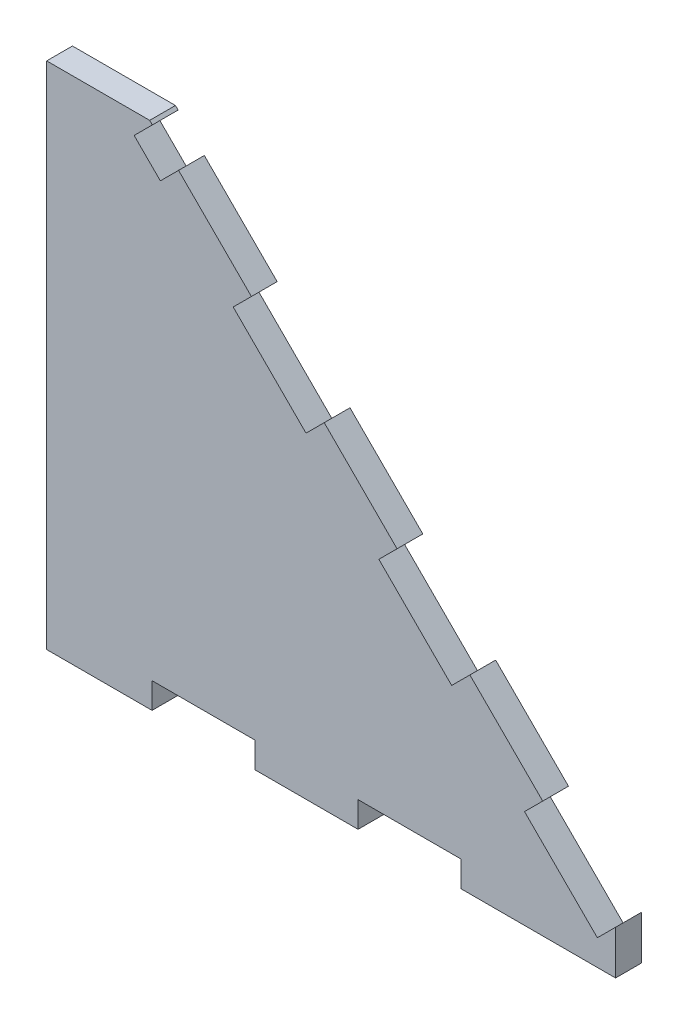
ISO-10303-21;
HEADER;
FILE_DESCRIPTION(('STEP AP214'),'2;1');
FILE_NAME('part.step','',(''),(''),'','','');
FILE_SCHEMA(('AUTOMOTIVE_DESIGN { 1 0 10303 214 1 1 1 1 }'));
ENDSEC;
DATA;
#1=APPLICATION_CONTEXT('core data for automotive mechanical design processes');
#2=APPLICATION_PROTOCOL_DEFINITION('international standard','automotive_design',2000,#1);
#3=PRODUCT_CONTEXT('',#1,'mechanical');
#4=PRODUCT('Part','Part','',(#3));
#5=PRODUCT_RELATED_PRODUCT_CATEGORY('part','',(#4));
#6=PRODUCT_DEFINITION_FORMATION('','',#4);
#7=PRODUCT_DEFINITION_CONTEXT('part definition',#1,'design');
#8=PRODUCT_DEFINITION('design','',#6,#7);
#9=PRODUCT_DEFINITION_SHAPE('','',#8);
#10=(LENGTH_UNIT() NAMED_UNIT(*) SI_UNIT(.MILLI.,.METRE.));
#11=(NAMED_UNIT(*) PLANE_ANGLE_UNIT() SI_UNIT($,.RADIAN.));
#12=(NAMED_UNIT(*) SI_UNIT($,.STERADIAN.) SOLID_ANGLE_UNIT());
#13=UNCERTAINTY_MEASURE_WITH_UNIT(LENGTH_MEASURE(1.E-05),#10,'distance_accuracy_value','');
#14=(GEOMETRIC_REPRESENTATION_CONTEXT(3) GLOBAL_UNCERTAINTY_ASSIGNED_CONTEXT((#13)) GLOBAL_UNIT_ASSIGNED_CONTEXT((#10,
#11,#12)) REPRESENTATION_CONTEXT('',''));
#15=CARTESIAN_POINT('',(0.,0.,0.));
#16=DIRECTION('',(0.,0.,1.));
#17=DIRECTION('',(1.,0.,0.));
#18=AXIS2_PLACEMENT_3D('',#15,#16,#17);
#19=CARTESIAN_POINT('',(0.,0.,3.175));
#20=DIRECTION('',(0.,1.,0.));
#21=DIRECTION('',(0.,0.,1.));
#22=AXIS2_PLACEMENT_3D('',#19,#20,#21);
#23=PLANE('',#22);
#24=DIRECTION('',(1.,0.,0.));
#25=VECTOR('',#24,1.);
#26=CARTESIAN_POINT('',(0.,0.,0.));
#27=LINE('',#26,#25);
#28=CARTESIAN_POINT('',(25.6917288172166,0.,0.));
#29=VERTEX_POINT('',#28);
#30=CARTESIAN_POINT('',(38.3917288172166,0.,0.));
#31=VERTEX_POINT('',#30);
#32=EDGE_CURVE('E237',#29,#31,#27,.T.);
#33=ORIENTED_EDGE('',*,*,#32,.T.);
#34=DIRECTION('',(0.,0.,1.));
#35=VECTOR('',#34,1.);
#36=CARTESIAN_POINT('',(38.3917288172166,0.,0.));
#37=LINE('',#36,#35);
#38=CARTESIAN_POINT('',(38.3917288172166,0.,3.175));
#39=VERTEX_POINT('',#38);
#40=EDGE_CURVE('E220',#31,#39,#37,.T.);
#41=ORIENTED_EDGE('',*,*,#40,.T.);
#42=DIRECTION('',(1.,0.,0.));
#43=VECTOR('',#42,1.);
#44=CARTESIAN_POINT('',(0.,0.,3.175));
#45=LINE('',#44,#43);
#46=CARTESIAN_POINT('',(25.6917288172166,0.,3.175));
#47=VERTEX_POINT('',#46);
#48=EDGE_CURVE('E460',#47,#39,#45,.T.);
#49=ORIENTED_EDGE('',*,*,#48,.F.);
#50=DIRECTION('',(0.,0.,1.));
#51=VECTOR('',#50,1.);
#52=CARTESIAN_POINT('',(25.6917288172166,0.,0.));
#53=LINE('',#52,#51);
#54=EDGE_CURVE('E243',#29,#47,#53,.T.);
#55=ORIENTED_EDGE('',*,*,#54,.F.);
#56=EDGE_LOOP('',(#33,#41,#49,#55));
#57=FACE_BOUND('',#56,.T.);
#58=ADVANCED_FACE('F34',(#57),#23,.F.);
#59=CARTESIAN_POINT('',(0.,0.,0.));
#60=VERTEX_POINT('',#59);
#61=CARTESIAN_POINT('',(12.9917288172166,0.,0.));
#62=VERTEX_POINT('',#61);
#63=EDGE_CURVE('E244',#60,#62,#27,.T.);
#64=ORIENTED_EDGE('',*,*,#63,.T.);
#65=DIRECTION('',(0.,0.,1.));
#66=VECTOR('',#65,1.);
#67=CARTESIAN_POINT('',(12.9917288172166,0.,0.));
#68=LINE('',#67,#66);
#69=CARTESIAN_POINT('',(12.9917288172166,0.,3.175));
#70=VERTEX_POINT('',#69);
#71=EDGE_CURVE('E426',#62,#70,#68,.T.);
#72=ORIENTED_EDGE('',*,*,#71,.T.);
#73=CARTESIAN_POINT('',(0.,0.,3.175));
#74=VERTEX_POINT('',#73);
#75=EDGE_CURVE('E457',#74,#70,#45,.T.);
#76=ORIENTED_EDGE('',*,*,#75,.F.);
#77=DIRECTION('',(0.,0.,-1.));
#78=VECTOR('',#77,1.);
#79=CARTESIAN_POINT('',(0.,0.,3.175));
#80=LINE('',#79,#78);
#81=EDGE_CURVE('E321',#74,#60,#80,.T.);
#82=ORIENTED_EDGE('',*,*,#81,.T.);
#83=EDGE_LOOP('',(#64,#72,#76,#82));
#84=FACE_BOUND('',#83,.T.);
#85=ADVANCED_FACE('F516',(#84),#23,.F.);
#86=CARTESIAN_POINT('',(35.5358323934748,35.5358323934746,3.175));
#87=DIRECTION('',(0.707106781186549,0.707106781186546,0.));
#88=DIRECTION('',(-0.707106781186546,0.707106781186549,0.));
#89=AXIS2_PLACEMENT_3D('',#86,#87,#88);
#90=PLANE('',#89);
#91=DIRECTION('',(0.707106781186546,-0.707106781186549,0.));
#92=VECTOR('',#91,1.);
#93=CARTESIAN_POINT('',(35.5358323934748,35.5358323934746,0.));
#94=LINE('',#93,#92);
#95=CARTESIAN_POINT('',(10.7822358569496,60.2894289299999,0.));
#96=VERTEX_POINT('',#95);
#97=CARTESIAN_POINT('',(14.0151280605345,57.056536726415,0.));
#98=VERTEX_POINT('',#97);
#99=EDGE_CURVE('E344',#96,#98,#94,.T.);
#100=ORIENTED_EDGE('',*,*,#99,.F.);
#101=DIRECTION('',(0.,0.,-1.));
#102=VECTOR('',#101,1.);
#103=CARTESIAN_POINT('',(10.7822358569496,60.2894289299999,3.175));
#104=LINE('',#103,#102);
#105=CARTESIAN_POINT('',(10.7822358569496,60.2894289299999,3.175));
#106=VERTEX_POINT('',#105);
#107=EDGE_CURVE('E11',#106,#96,#104,.T.);
#108=ORIENTED_EDGE('',*,*,#107,.F.);
#109=DIRECTION('',(0.707106781186546,-0.707106781186549,0.));
#110=VECTOR('',#109,1.);
#111=CARTESIAN_POINT('',(35.5358323934748,35.5358323934746,3.175));
#112=LINE('',#111,#110);
#113=CARTESIAN_POINT('',(14.0151280605345,57.056536726415,3.175));
#114=VERTEX_POINT('',#113);
#115=EDGE_CURVE('E288',#106,#114,#112,.T.);
#116=ORIENTED_EDGE('',*,*,#115,.T.);
#117=DIRECTION('',(0.,0.,-1.));
#118=VECTOR('',#117,1.);
#119=CARTESIAN_POINT('',(14.0151280605345,57.056536726415,3.175));
#120=LINE('',#119,#118);
#121=EDGE_CURVE('E289',#114,#98,#120,.T.);
#122=ORIENTED_EDGE('',*,*,#121,.T.);
#123=EDGE_LOOP('',(#100,#108,#116,#122));
#124=FACE_BOUND('',#123,.T.);
#125=ADVANCED_FACE('F36',(#124),#90,.T.);
#126=CARTESIAN_POINT('',(-24.7535965365252,24.7535965365252,3.175));
#127=DIRECTION('',(0.707106781186546,-0.707106781186548,0.));
#128=DIRECTION('',(0.707106781186549,0.707106781186547,0.));
#129=AXIS2_PLACEMENT_3D('',#126,#127,#128);
#130=PLANE('',#129);
#131=DIRECTION('',(-0.707106781186549,-0.707106781186546,0.));
#132=VECTOR('',#131,1.);
#133=CARTESIAN_POINT('',(-24.7535965365252,24.7535965365252,0.));
#134=LINE('',#133,#132);
#135=CARTESIAN_POINT('',(13.0272998872169,62.5344929602672,0.));
#136=VERTEX_POINT('',#135);
#137=EDGE_CURVE('E340',#136,#96,#134,.T.);
#138=ORIENTED_EDGE('',*,*,#137,.F.);
#139=DIRECTION('',(0.,0.,-1.));
#140=VECTOR('',#139,1.);
#141=CARTESIAN_POINT('',(13.0272998872169,62.5344929602672,3.175));
#142=LINE('',#141,#140);
#143=CARTESIAN_POINT('',(13.0272998872169,62.5344929602672,3.175));
#144=VERTEX_POINT('',#143);
#145=EDGE_CURVE('E42',#144,#136,#142,.T.);
#146=ORIENTED_EDGE('',*,*,#145,.F.);
#147=DIRECTION('',(-0.707106781186549,-0.707106781186546,0.));
#148=VECTOR('',#147,1.);
#149=CARTESIAN_POINT('',(-24.7535965365252,24.7535965365252,3.175));
#150=LINE('',#149,#148);
#151=EDGE_CURVE('E447',#144,#106,#150,.T.);
#152=ORIENTED_EDGE('',*,*,#151,.T.);
#153=ORIENTED_EDGE('',*,*,#107,.T.);
#154=EDGE_LOOP('',(#138,#146,#152,#153));
#155=FACE_BOUND('',#154,.T.);
#156=ADVANCED_FACE('F341',(#155),#130,.T.);
#157=CARTESIAN_POINT('',(37.7808964237421,37.7808964237419,3.175));
#158=DIRECTION('',(0.707106781186549,0.707106781186546,0.));
#159=DIRECTION('',(-0.707106781186546,0.707106781186549,0.));
#160=AXIS2_PLACEMENT_3D('',#157,#158,#159);
#161=PLANE('',#160);
#162=DIRECTION('',(0.707106781186546,-0.707106781186549,0.));
#163=VECTOR('',#162,1.);
#164=CARTESIAN_POINT('',(37.7808964237421,37.7808964237419,0.));
#165=LINE('',#164,#163);
#166=CARTESIAN_POINT('',(12.7,62.8617928474841,0.));
#167=VERTEX_POINT('',#166);
#168=EDGE_CURVE('E332',#167,#136,#165,.T.);
#169=ORIENTED_EDGE('',*,*,#168,.F.);
#170=DIRECTION('',(0.,0.,-1.));
#171=VECTOR('',#170,1.);
#172=CARTESIAN_POINT('',(12.7,62.8617928474841,3.175));
#173=LINE('',#172,#171);
#174=CARTESIAN_POINT('',(12.7,62.8617928474841,3.175));
#175=VERTEX_POINT('',#174);
#176=EDGE_CURVE('E325',#175,#167,#173,.T.);
#177=ORIENTED_EDGE('',*,*,#176,.F.);
#178=DIRECTION('',(0.707106781186546,-0.707106781186549,0.));
#179=VECTOR('',#178,1.);
#180=CARTESIAN_POINT('',(37.7808964237421,37.7808964237419,3.175));
#181=LINE('',#180,#179);
#182=EDGE_CURVE('E335',#175,#144,#181,.T.);
#183=ORIENTED_EDGE('',*,*,#182,.T.);
#184=ORIENTED_EDGE('',*,*,#145,.T.);
#185=EDGE_LOOP('',(#169,#177,#183,#184));
#186=FACE_BOUND('',#185,.T.);
#187=ADVANCED_FACE('F330',(#186),#161,.T.);
#188=CARTESIAN_POINT('',(0.,62.8617928474841,3.175));
#189=DIRECTION('',(0.,1.,0.));
#190=DIRECTION('',(0.,0.,1.));
#191=AXIS2_PLACEMENT_3D('',#188,#189,#190);
#192=PLANE('',#191);
#193=DIRECTION('',(1.,0.,0.));
#194=VECTOR('',#193,1.);
#195=CARTESIAN_POINT('',(0.,62.8617928474841,0.));
#196=LINE('',#195,#194);
#197=CARTESIAN_POINT('',(0.,62.8617928474841,0.));
#198=VERTEX_POINT('',#197);
#199=EDGE_CURVE('E348',#198,#167,#196,.T.);
#200=ORIENTED_EDGE('',*,*,#199,.F.);
#201=DIRECTION('',(0.,0.,-1.));
#202=VECTOR('',#201,1.);
#203=CARTESIAN_POINT('',(0.,62.8617928474841,3.175));
#204=LINE('',#203,#202);
#205=CARTESIAN_POINT('',(0.,62.8617928474841,3.175));
#206=VERTEX_POINT('',#205);
#207=EDGE_CURVE('E323',#206,#198,#204,.T.);
#208=ORIENTED_EDGE('',*,*,#207,.F.);
#209=DIRECTION('',(1.,0.,0.));
#210=VECTOR('',#209,1.);
#211=CARTESIAN_POINT('',(0.,62.8617928474841,3.175));
#212=LINE('',#211,#210);
#213=EDGE_CURVE('E450',#206,#175,#212,.T.);
#214=ORIENTED_EDGE('',*,*,#213,.T.);
#215=ORIENTED_EDGE('',*,*,#176,.T.);
#216=EDGE_LOOP('',(#200,#208,#214,#215));
#217=FACE_BOUND('',#216,.T.);
#218=ADVANCED_FACE('F530',(#217),#192,.T.);
#219=CARTESIAN_POINT('',(0.,0.,3.175));
#220=DIRECTION('',(-1.,0.,0.));
#221=DIRECTION('',(0.,0.,1.));
#222=AXIS2_PLACEMENT_3D('',#219,#220,#221);
#223=PLANE('',#222);
#224=DIRECTION('',(0.,1.,0.));
#225=VECTOR('',#224,1.);
#226=CARTESIAN_POINT('',(0.,0.,0.));
#227=LINE('',#226,#225);
#228=EDGE_CURVE('E249',#60,#198,#227,.T.);
#229=ORIENTED_EDGE('',*,*,#228,.F.);
#230=ORIENTED_EDGE('',*,*,#81,.F.);
#231=DIRECTION('',(0.,1.,0.));
#232=VECTOR('',#231,1.);
#233=CARTESIAN_POINT('',(0.,0.,3.175));
#234=LINE('',#233,#232);
#235=EDGE_CURVE('E454',#74,#206,#234,.T.);
#236=ORIENTED_EDGE('',*,*,#235,.T.);
#237=ORIENTED_EDGE('',*,*,#207,.T.);
#238=EDGE_LOOP('',(#229,#230,#236,#237));
#239=FACE_BOUND('',#238,.T.);
#240=ADVANCED_FACE('F525',(#239),#223,.T.);
#241=CARTESIAN_POINT('',(51.0917288172166,0.,3.175));
#242=VERTEX_POINT('',#241);
#243=CARTESIAN_POINT('',(70.1417288172166,0.,3.175));
#244=VERTEX_POINT('',#243);
#245=EDGE_CURVE('E411',#242,#244,#45,.T.);
#246=ORIENTED_EDGE('',*,*,#245,.F.);
#247=DIRECTION('',(0.,0.,1.));
#248=VECTOR('',#247,1.);
#249=CARTESIAN_POINT('',(51.0917288172166,0.,0.));
#250=LINE('',#249,#248);
#251=CARTESIAN_POINT('',(51.0917288172166,0.,0.));
#252=VERTEX_POINT('',#251);
#253=EDGE_CURVE('E231',#252,#242,#250,.T.);
#254=ORIENTED_EDGE('',*,*,#253,.F.);
#255=CARTESIAN_POINT('',(70.1417288172166,0.,0.));
#256=VERTEX_POINT('',#255);
#257=EDGE_CURVE('E245',#252,#256,#27,.T.);
#258=ORIENTED_EDGE('',*,*,#257,.T.);
#259=DIRECTION('',(0.,0.,-1.));
#260=VECTOR('',#259,1.);
#261=CARTESIAN_POINT('',(70.1417288172166,0.,3.175));
#262=LINE('',#261,#260);
#263=EDGE_CURVE('E318',#244,#256,#262,.T.);
#264=ORIENTED_EDGE('',*,*,#263,.F.);
#265=EDGE_LOOP('',(#246,#254,#258,#264));
#266=FACE_BOUND('',#265,.T.);
#267=ADVANCED_FACE('F410',(#266),#23,.F.);
#268=CARTESIAN_POINT('',(70.1417288172166,0.,3.175));
#269=DIRECTION('',(1.,0.,0.));
#270=DIRECTION('',(0.,0.,-1.));
#271=AXIS2_PLACEMENT_3D('',#268,#269,#270);
#272=PLANE('',#271);
#273=DIRECTION('',(0.,-1.,0.));
#274=VECTOR('',#273,1.);
#275=CARTESIAN_POINT('',(70.1417288172166,0.,0.));
#276=LINE('',#275,#274);
#277=CARTESIAN_POINT('',(70.1417288172166,5.42006403026728,0.));
#278=VERTEX_POINT('',#277);
#279=EDGE_CURVE('E248',#278,#256,#276,.T.);
#280=ORIENTED_EDGE('',*,*,#279,.F.);
#281=DIRECTION('',(0.,0.,-1.));
#282=VECTOR('',#281,1.);
#283=CARTESIAN_POINT('',(70.1417288172166,5.42006403026728,3.175));
#284=LINE('',#283,#282);
#285=CARTESIAN_POINT('',(70.1417288172166,5.42006403026728,3.175));
#286=VERTEX_POINT('',#285);
#287=EDGE_CURVE('E316',#286,#278,#284,.T.);
#288=ORIENTED_EDGE('',*,*,#287,.F.);
#289=DIRECTION('',(0.,-1.,0.));
#290=VECTOR('',#289,1.);
#291=CARTESIAN_POINT('',(70.1417288172166,0.,3.175));
#292=LINE('',#291,#290);
#293=EDGE_CURVE('E404',#286,#244,#292,.T.);
#294=ORIENTED_EDGE('',*,*,#293,.T.);
#295=ORIENTED_EDGE('',*,*,#263,.T.);
#296=EDGE_LOOP('',(#280,#288,#294,#295));
#297=FACE_BOUND('',#296,.T.);
#298=ADVANCED_FACE('F403',(#297),#272,.T.);
#299=CARTESIAN_POINT('',(32.3608323934744,-32.3608323934746,3.175));
#300=DIRECTION('',(0.707106781186545,-0.70710678118655,0.));
#301=DIRECTION('',(0.70710678118655,0.707106781186545,0.));
#302=AXIS2_PLACEMENT_3D('',#299,#300,#301);
#303=PLANE('',#302);
#304=DIRECTION('',(-0.70710678118655,-0.707106781186545,0.));
#305=VECTOR('',#304,1.);
#306=CARTESIAN_POINT('',(32.3608323934744,-32.3608323934746,0.));
#307=LINE('',#306,#305);
#308=CARTESIAN_POINT('',(67.8966647869493,3.175,0.));
#309=VERTEX_POINT('',#308);
#310=EDGE_CURVE('E255',#278,#309,#307,.T.);
#311=ORIENTED_EDGE('',*,*,#310,.T.);
#312=DIRECTION('',(0.,0.,-1.));
#313=VECTOR('',#312,1.);
#314=CARTESIAN_POINT('',(67.8966647869493,3.175,3.175));
#315=LINE('',#314,#313);
#316=CARTESIAN_POINT('',(67.8966647869493,3.175,3.175));
#317=VERTEX_POINT('',#316);
#318=EDGE_CURVE('E314',#317,#309,#315,.T.);
#319=ORIENTED_EDGE('',*,*,#318,.F.);
#320=DIRECTION('',(-0.70710678118655,-0.707106781186545,0.));
#321=VECTOR('',#320,1.);
#322=CARTESIAN_POINT('',(32.3608323934744,-32.3608323934746,3.175));
#323=LINE('',#322,#321);
#324=EDGE_CURVE('E399',#286,#317,#323,.T.);
#325=ORIENTED_EDGE('',*,*,#324,.F.);
#326=ORIENTED_EDGE('',*,*,#287,.T.);
#327=EDGE_LOOP('',(#311,#319,#325,#326));
#328=FACE_BOUND('',#327,.T.);
#329=ADVANCED_FACE('F398',(#328),#303,.F.);
#330=CARTESIAN_POINT('',(35.5358323934748,35.5358323934746,3.175));
#331=DIRECTION('',(0.707106781186549,0.707106781186546,0.));
#332=DIRECTION('',(-0.707106781186546,0.707106781186549,0.));
#333=AXIS2_PLACEMENT_3D('',#330,#331,#332);
#334=PLANE('',#333);
#335=DIRECTION('',(0.707106781186546,-0.707106781186549,0.));
#336=VECTOR('',#335,1.);
#337=CARTESIAN_POINT('',(35.5358323934748,35.5358323934746,0.));
#338=LINE('',#337,#336);
#339=CARTESIAN_POINT('',(58.9164086658802,12.1552561210692,0.));
#340=VERTEX_POINT('',#339);
#341=EDGE_CURVE('E258',#340,#309,#338,.T.);
#342=ORIENTED_EDGE('',*,*,#341,.F.);
#343=DIRECTION('',(0.,0.,-1.));
#344=VECTOR('',#343,1.);
#345=CARTESIAN_POINT('',(58.9164086658802,12.1552561210692,3.175));
#346=LINE('',#345,#344);
#347=CARTESIAN_POINT('',(58.9164086658802,12.1552561210692,3.175));
#348=VERTEX_POINT('',#347);
#349=EDGE_CURVE('E312',#348,#340,#346,.T.);
#350=ORIENTED_EDGE('',*,*,#349,.F.);
#351=DIRECTION('',(0.707106781186546,-0.707106781186549,0.));
#352=VECTOR('',#351,1.);
#353=CARTESIAN_POINT('',(35.5358323934748,35.5358323934746,3.175));
#354=LINE('',#353,#352);
#355=EDGE_CURVE('E395',#348,#317,#354,.T.);
#356=ORIENTED_EDGE('',*,*,#355,.T.);
#357=ORIENTED_EDGE('',*,*,#318,.T.);
#358=EDGE_LOOP('',(#342,#350,#356,#357));
#359=FACE_BOUND('',#358,.T.);
#360=ADVANCED_FACE('F391',(#359),#334,.T.);
#361=CARTESIAN_POINT('',(23.3805762724053,-23.3805762724055,3.175));
#362=DIRECTION('',(0.707106781186545,-0.70710678118655,0.));
#363=DIRECTION('',(0.70710678118655,0.707106781186545,0.));
#364=AXIS2_PLACEMENT_3D('',#361,#362,#363);
#365=PLANE('',#364);
#366=DIRECTION('',(-0.70710678118655,-0.707106781186545,0.));
#367=VECTOR('',#366,1.);
#368=CARTESIAN_POINT('',(23.3805762724053,-23.3805762724055,0.));
#369=LINE('',#368,#367);
#370=CARTESIAN_POINT('',(61.1614726961475,14.4003201513364,0.));
#371=VERTEX_POINT('',#370);
#372=EDGE_CURVE('E261',#371,#340,#369,.T.);
#373=ORIENTED_EDGE('',*,*,#372,.F.);
#374=DIRECTION('',(0.,0.,-1.));
#375=VECTOR('',#374,1.);
#376=CARTESIAN_POINT('',(61.1614726961475,14.4003201513364,3.175));
#377=LINE('',#376,#375);
#378=CARTESIAN_POINT('',(61.1614726961475,14.4003201513364,3.175));
#379=VERTEX_POINT('',#378);
#380=EDGE_CURVE('E310',#379,#371,#377,.T.);
#381=ORIENTED_EDGE('',*,*,#380,.F.);
#382=DIRECTION('',(-0.70710678118655,-0.707106781186545,0.));
#383=VECTOR('',#382,1.);
#384=CARTESIAN_POINT('',(23.3805762724053,-23.3805762724055,3.175));
#385=LINE('',#384,#383);
#386=EDGE_CURVE('E464',#379,#348,#385,.T.);
#387=ORIENTED_EDGE('',*,*,#386,.T.);
#388=ORIENTED_EDGE('',*,*,#349,.T.);
#389=EDGE_LOOP('',(#373,#381,#387,#388));
#390=FACE_BOUND('',#389,.T.);
#391=ADVANCED_FACE('F386',(#390),#365,.T.);
#392=CARTESIAN_POINT('',(52.1812165750783,23.3805762724056,0.));
#393=VERTEX_POINT('',#392);
#394=EDGE_CURVE('E264',#393,#371,#165,.T.);
#395=ORIENTED_EDGE('',*,*,#394,.F.);
#396=DIRECTION('',(0.,0.,-1.));
#397=VECTOR('',#396,1.);
#398=CARTESIAN_POINT('',(52.1812165750783,23.3805762724056,3.175));
#399=LINE('',#398,#397);
#400=CARTESIAN_POINT('',(52.1812165750783,23.3805762724056,3.175));
#401=VERTEX_POINT('',#400);
#402=EDGE_CURVE('E308',#401,#393,#399,.T.);
#403=ORIENTED_EDGE('',*,*,#402,.F.);
#404=EDGE_CURVE('E382',#401,#379,#181,.T.);
#405=ORIENTED_EDGE('',*,*,#404,.T.);
#406=ORIENTED_EDGE('',*,*,#380,.T.);
#407=EDGE_LOOP('',(#395,#403,#405,#406));
#408=FACE_BOUND('',#407,.T.);
#409=ADVANCED_FACE('F377',(#408),#161,.T.);
#410=CARTESIAN_POINT('',(14.4003201513362,-14.4003201513363,3.175));
#411=DIRECTION('',(0.707106781186545,-0.70710678118655,0.));
#412=DIRECTION('',(0.70710678118655,0.707106781186545,0.));
#413=AXIS2_PLACEMENT_3D('',#410,#411,#412);
#414=PLANE('',#413);
#415=DIRECTION('',(-0.70710678118655,-0.707106781186545,0.));
#416=VECTOR('',#415,1.);
#417=CARTESIAN_POINT('',(14.4003201513362,-14.4003201513363,0.));
#418=LINE('',#417,#416);
#419=CARTESIAN_POINT('',(49.9361525448109,21.1355122421382,0.));
#420=VERTEX_POINT('',#419);
#421=EDGE_CURVE('E265',#393,#420,#418,.T.);
#422=ORIENTED_EDGE('',*,*,#421,.T.);
#423=DIRECTION('',(0.,0.,-1.));
#424=VECTOR('',#423,1.);
#425=CARTESIAN_POINT('',(49.9361525448109,21.1355122421382,3.175));
#426=LINE('',#425,#424);
#427=CARTESIAN_POINT('',(49.9361525448109,21.1355122421382,3.175));
#428=VERTEX_POINT('',#427);
#429=EDGE_CURVE('E306',#428,#420,#426,.T.);
#430=ORIENTED_EDGE('',*,*,#429,.F.);
#431=DIRECTION('',(-0.70710678118655,-0.707106781186545,0.));
#432=VECTOR('',#431,1.);
#433=CARTESIAN_POINT('',(14.4003201513362,-14.4003201513363,3.175));
#434=LINE('',#433,#432);
#435=EDGE_CURVE('E466',#401,#428,#434,.T.);
#436=ORIENTED_EDGE('',*,*,#435,.F.);
#437=ORIENTED_EDGE('',*,*,#402,.T.);
#438=EDGE_LOOP('',(#422,#430,#436,#437));
#439=FACE_BOUND('',#438,.T.);
#440=ADVANCED_FACE('F505',(#439),#414,.F.);
#441=CARTESIAN_POINT('',(35.5358323934746,35.5358323934745,3.175));
#442=DIRECTION('',(0.707106781186549,0.707106781186546,0.));
#443=DIRECTION('',(-0.707106781186546,0.707106781186549,0.));
#444=AXIS2_PLACEMENT_3D('',#441,#442,#443);
#445=PLANE('',#444);
#446=DIRECTION('',(0.707106781186546,-0.707106781186549,0.));
#447=VECTOR('',#446,1.);
#448=CARTESIAN_POINT('',(35.5358323934746,35.5358323934745,0.));
#449=LINE('',#448,#447);
#450=CARTESIAN_POINT('',(40.9558964237418,30.1157683632074,0.));
#451=VERTEX_POINT('',#450);
#452=EDGE_CURVE('E268',#451,#420,#449,.T.);
#453=ORIENTED_EDGE('',*,*,#452,.F.);
#454=DIRECTION('',(0.,0.,-1.));
#455=VECTOR('',#454,1.);
#456=CARTESIAN_POINT('',(40.9558964237418,30.1157683632074,3.175));
#457=LINE('',#456,#455);
#458=CARTESIAN_POINT('',(40.9558964237418,30.1157683632074,3.175));
#459=VERTEX_POINT('',#458);
#460=EDGE_CURVE('E304',#459,#451,#457,.T.);
#461=ORIENTED_EDGE('',*,*,#460,.F.);
#462=DIRECTION('',(0.707106781186546,-0.707106781186549,0.));
#463=VECTOR('',#462,1.);
#464=CARTESIAN_POINT('',(35.5358323934746,35.5358323934745,3.175));
#465=LINE('',#464,#463);
#466=EDGE_CURVE('E468',#459,#428,#465,.T.);
#467=ORIENTED_EDGE('',*,*,#466,.T.);
#468=ORIENTED_EDGE('',*,*,#429,.T.);
#469=EDGE_LOOP('',(#453,#461,#467,#468));
#470=FACE_BOUND('',#469,.T.);
#471=ADVANCED_FACE('F373',(#470),#445,.T.);
#472=CARTESIAN_POINT('',(5.4200640302671,-5.42006403026713,3.175));
#473=DIRECTION('',(0.707106781186546,-0.707106781186549,0.));
#474=DIRECTION('',(0.707106781186549,0.707106781186546,0.));
#475=AXIS2_PLACEMENT_3D('',#472,#473,#474);
#476=PLANE('',#475);
#477=DIRECTION('',(-0.707106781186549,-0.707106781186546,0.));
#478=VECTOR('',#477,1.);
#479=CARTESIAN_POINT('',(5.4200640302671,-5.42006403026713,0.));
#480=LINE('',#479,#478);
#481=CARTESIAN_POINT('',(43.2009604540092,32.3608323934748,0.));
#482=VERTEX_POINT('',#481);
#483=EDGE_CURVE('E271',#482,#451,#480,.T.);
#484=ORIENTED_EDGE('',*,*,#483,.F.);
#485=DIRECTION('',(0.,0.,-1.));
#486=VECTOR('',#485,1.);
#487=CARTESIAN_POINT('',(43.2009604540092,32.3608323934748,3.175));
#488=LINE('',#487,#486);
#489=CARTESIAN_POINT('',(43.2009604540092,32.3608323934748,3.175));
#490=VERTEX_POINT('',#489);
#491=EDGE_CURVE('E302',#490,#482,#488,.T.);
#492=ORIENTED_EDGE('',*,*,#491,.F.);
#493=DIRECTION('',(-0.707106781186549,-0.707106781186546,0.));
#494=VECTOR('',#493,1.);
#495=CARTESIAN_POINT('',(5.4200640302671,-5.42006403026713,3.175));
#496=LINE('',#495,#494);
#497=EDGE_CURVE('E369',#490,#459,#496,.T.);
#498=ORIENTED_EDGE('',*,*,#497,.T.);
#499=ORIENTED_EDGE('',*,*,#460,.T.);
#500=EDGE_LOOP('',(#484,#492,#498,#499));
#501=FACE_BOUND('',#500,.T.);
#502=ADVANCED_FACE('F367',(#501),#476,.T.);
#503=CARTESIAN_POINT('',(34.22070433294,41.3410885145439,0.));
#504=VERTEX_POINT('',#503);
#505=EDGE_CURVE('E274',#504,#482,#165,.T.);
#506=ORIENTED_EDGE('',*,*,#505,.F.);
#507=DIRECTION('',(0.,0.,-1.));
#508=VECTOR('',#507,1.);
#509=CARTESIAN_POINT('',(34.22070433294,41.3410885145439,3.175));
#510=LINE('',#509,#508);
#511=CARTESIAN_POINT('',(34.22070433294,41.3410885145439,3.175));
#512=VERTEX_POINT('',#511);
#513=EDGE_CURVE('E300',#512,#504,#510,.T.);
#514=ORIENTED_EDGE('',*,*,#513,.F.);
#515=EDGE_CURVE('E363',#512,#490,#181,.T.);
#516=ORIENTED_EDGE('',*,*,#515,.T.);
#517=ORIENTED_EDGE('',*,*,#491,.T.);
#518=EDGE_LOOP('',(#506,#514,#516,#517));
#519=FACE_BOUND('',#518,.T.);
#520=ADVANCED_FACE('F359',(#519),#161,.T.);
#521=CARTESIAN_POINT('',(-3.56019209080205,3.56019209080207,3.175));
#522=DIRECTION('',(0.707106781186545,-0.70710678118655,0.));
#523=DIRECTION('',(0.70710678118655,0.707106781186545,0.));
#524=AXIS2_PLACEMENT_3D('',#521,#522,#523);
#525=PLANE('',#524);
#526=DIRECTION('',(-0.70710678118655,-0.707106781186545,0.));
#527=VECTOR('',#526,1.);
#528=CARTESIAN_POINT('',(-3.56019209080205,3.56019209080207,0.));
#529=LINE('',#528,#527);
#530=CARTESIAN_POINT('',(31.9756403026725,39.0960244842764,0.));
#531=VERTEX_POINT('',#530);
#532=EDGE_CURVE('E275',#504,#531,#529,.T.);
#533=ORIENTED_EDGE('',*,*,#532,.T.);
#534=DIRECTION('',(0.,0.,-1.));
#535=VECTOR('',#534,1.);
#536=CARTESIAN_POINT('',(31.9756403026725,39.0960244842764,3.175));
#537=LINE('',#536,#535);
#538=CARTESIAN_POINT('',(31.9756403026725,39.0960244842764,3.175));
#539=VERTEX_POINT('',#538);
#540=EDGE_CURVE('E298',#539,#531,#537,.T.);
#541=ORIENTED_EDGE('',*,*,#540,.F.);
#542=DIRECTION('',(-0.70710678118655,-0.707106781186545,0.));
#543=VECTOR('',#542,1.);
#544=CARTESIAN_POINT('',(-3.56019209080205,3.56019209080207,3.175));
#545=LINE('',#544,#543);
#546=EDGE_CURVE('E471',#512,#539,#545,.T.);
#547=ORIENTED_EDGE('',*,*,#546,.F.);
#548=ORIENTED_EDGE('',*,*,#513,.T.);
#549=EDGE_LOOP('',(#533,#541,#547,#548));
#550=FACE_BOUND('',#549,.T.);
#551=ADVANCED_FACE('F502',(#550),#525,.F.);
#552=CARTESIAN_POINT('',(35.5358323934745,35.5358323934744,3.175));
#553=DIRECTION('',(0.707106781186549,0.707106781186546,0.));
#554=DIRECTION('',(-0.707106781186546,0.707106781186549,0.));
#555=AXIS2_PLACEMENT_3D('',#552,#553,#554);
#556=PLANE('',#555);
#557=DIRECTION('',(0.707106781186546,-0.707106781186549,0.));
#558=VECTOR('',#557,1.);
#559=CARTESIAN_POINT('',(35.5358323934745,35.5358323934744,0.));
#560=LINE('',#559,#558);
#561=CARTESIAN_POINT('',(22.9953841816034,48.0762806053456,0.));
#562=VERTEX_POINT('',#561);
#563=EDGE_CURVE('E278',#562,#531,#560,.T.);
#564=ORIENTED_EDGE('',*,*,#563,.F.);
#565=DIRECTION('',(0.,0.,-1.));
#566=VECTOR('',#565,1.);
#567=CARTESIAN_POINT('',(22.9953841816034,48.0762806053456,3.175));
#568=LINE('',#567,#566);
#569=CARTESIAN_POINT('',(22.9953841816034,48.0762806053456,3.175));
#570=VERTEX_POINT('',#569);
#571=EDGE_CURVE('E296',#570,#562,#568,.T.);
#572=ORIENTED_EDGE('',*,*,#571,.F.);
#573=DIRECTION('',(0.707106781186546,-0.707106781186549,0.));
#574=VECTOR('',#573,1.);
#575=CARTESIAN_POINT('',(35.5358323934745,35.5358323934744,3.175));
#576=LINE('',#575,#574);
#577=EDGE_CURVE('E473',#570,#539,#576,.T.);
#578=ORIENTED_EDGE('',*,*,#577,.T.);
#579=ORIENTED_EDGE('',*,*,#540,.T.);
#580=EDGE_LOOP('',(#564,#572,#578,#579));
#581=FACE_BOUND('',#580,.T.);
#582=ADVANCED_FACE('F499',(#581),#556,.T.);
#583=CARTESIAN_POINT('',(-12.5404482118712,12.5404482118713,3.175));
#584=DIRECTION('',(0.707106781186544,-0.707106781186551,0.));
#585=DIRECTION('',(0.707106781186551,0.707106781186544,0.));
#586=AXIS2_PLACEMENT_3D('',#583,#584,#585);
#587=PLANE('',#586);
#588=DIRECTION('',(-0.707106781186551,-0.707106781186544,0.));
#589=VECTOR('',#588,1.);
#590=CARTESIAN_POINT('',(-12.5404482118712,12.5404482118713,0.));
#591=LINE('',#590,#589);
#592=CARTESIAN_POINT('',(25.2404482118709,50.3213446356131,0.));
#593=VERTEX_POINT('',#592);
#594=EDGE_CURVE('E281',#593,#562,#591,.T.);
#595=ORIENTED_EDGE('',*,*,#594,.F.);
#596=DIRECTION('',(0.,0.,-1.));
#597=VECTOR('',#596,1.);
#598=CARTESIAN_POINT('',(25.2404482118709,50.3213446356131,3.175));
#599=LINE('',#598,#597);
#600=CARTESIAN_POINT('',(25.2404482118709,50.3213446356131,3.175));
#601=VERTEX_POINT('',#600);
#602=EDGE_CURVE('E294',#601,#593,#599,.T.);
#603=ORIENTED_EDGE('',*,*,#602,.F.);
#604=DIRECTION('',(-0.707106781186551,-0.707106781186544,0.));
#605=VECTOR('',#604,1.);
#606=CARTESIAN_POINT('',(-12.5404482118712,12.5404482118713,3.175));
#607=LINE('',#606,#605);
#608=EDGE_CURVE('E476',#601,#570,#607,.T.);
#609=ORIENTED_EDGE('',*,*,#608,.T.);
#610=ORIENTED_EDGE('',*,*,#571,.T.);
#611=EDGE_LOOP('',(#595,#603,#609,#610));
#612=FACE_BOUND('',#611,.T.);
#613=ADVANCED_FACE('F495',(#612),#587,.T.);
#614=CARTESIAN_POINT('',(16.2601920908018,59.3016007566823,0.));
#615=VERTEX_POINT('',#614);
#616=EDGE_CURVE('E284',#615,#593,#165,.T.);
#617=ORIENTED_EDGE('',*,*,#616,.F.);
#618=DIRECTION('',(0.,0.,-1.));
#619=VECTOR('',#618,1.);
#620=CARTESIAN_POINT('',(16.2601920908018,59.3016007566823,3.175));
#621=LINE('',#620,#619);
#622=CARTESIAN_POINT('',(16.2601920908018,59.3016007566823,3.175));
#623=VERTEX_POINT('',#622);
#624=EDGE_CURVE('E291',#623,#615,#621,.T.);
#625=ORIENTED_EDGE('',*,*,#624,.F.);
#626=EDGE_CURVE('E451',#623,#601,#181,.T.);
#627=ORIENTED_EDGE('',*,*,#626,.T.);
#628=ORIENTED_EDGE('',*,*,#602,.T.);
#629=EDGE_LOOP('',(#617,#625,#627,#628));
#630=FACE_BOUND('',#629,.T.);
#631=ADVANCED_FACE('F491',(#630),#161,.T.);
#632=CARTESIAN_POINT('',(-21.5207043329403,21.5207043329404,3.175));
#633=DIRECTION('',(0.707106781186546,-0.707106781186549,0.));
#634=DIRECTION('',(0.707106781186549,0.707106781186546,0.));
#635=AXIS2_PLACEMENT_3D('',#632,#633,#634);
#636=PLANE('',#635);
#637=DIRECTION('',(-0.707106781186549,-0.707106781186546,0.));
#638=VECTOR('',#637,1.);
#639=CARTESIAN_POINT('',(-21.5207043329403,21.5207043329404,0.));
#640=LINE('',#639,#638);
#641=EDGE_CURVE('E285',#615,#98,#640,.T.);
#642=ORIENTED_EDGE('',*,*,#641,.T.);
#643=ORIENTED_EDGE('',*,*,#121,.F.);
#644=DIRECTION('',(-0.707106781186549,-0.707106781186546,0.));
#645=VECTOR('',#644,1.);
#646=CARTESIAN_POINT('',(-21.5207043329403,21.5207043329404,3.175));
#647=LINE('',#646,#645);
#648=EDGE_CURVE('E292',#623,#114,#647,.T.);
#649=ORIENTED_EDGE('',*,*,#648,.F.);
#650=ORIENTED_EDGE('',*,*,#624,.T.);
#651=EDGE_LOOP('',(#642,#643,#649,#650));
#652=FACE_BOUND('',#651,.T.);
#653=ADVANCED_FACE('F487',(#652),#636,.F.);
#654=CARTESIAN_POINT('',(0.,0.,3.175));
#655=DIRECTION('',(0.,0.,1.));
#656=DIRECTION('',(1.,0.,0.));
#657=AXIS2_PLACEMENT_3D('',#654,#655,#656);
#658=PLANE('',#657);
#659=DIRECTION('',(0.,-1.,0.));
#660=VECTOR('',#659,1.);
#661=CARTESIAN_POINT('',(38.3917288172166,0.,3.175));
#662=LINE('',#661,#660);
#663=CARTESIAN_POINT('',(38.3917288172166,3.175,3.175));
#664=VERTEX_POINT('',#663);
#665=EDGE_CURVE('E226',#664,#39,#662,.T.);
#666=ORIENTED_EDGE('',*,*,#665,.F.);
#667=DIRECTION('',(-1.,0.,0.));
#668=VECTOR('',#667,1.);
#669=CARTESIAN_POINT('',(0.,3.175,3.175));
#670=LINE('',#669,#668);
#671=CARTESIAN_POINT('',(51.0917288172166,3.175,3.175));
#672=VERTEX_POINT('',#671);
#673=EDGE_CURVE('E442',#672,#664,#670,.T.);
#674=ORIENTED_EDGE('',*,*,#673,.F.);
#675=DIRECTION('',(0.,1.,0.));
#676=VECTOR('',#675,1.);
#677=CARTESIAN_POINT('',(51.0917288172166,0.,3.175));
#678=LINE('',#677,#676);
#679=EDGE_CURVE('E440',#242,#672,#678,.T.);
#680=ORIENTED_EDGE('',*,*,#679,.F.);
#681=ORIENTED_EDGE('',*,*,#245,.T.);
#682=ORIENTED_EDGE('',*,*,#293,.F.);
#683=ORIENTED_EDGE('',*,*,#324,.T.);
#684=ORIENTED_EDGE('',*,*,#355,.F.);
#685=ORIENTED_EDGE('',*,*,#386,.F.);
#686=ORIENTED_EDGE('',*,*,#404,.F.);
#687=ORIENTED_EDGE('',*,*,#435,.T.);
#688=ORIENTED_EDGE('',*,*,#466,.F.);
#689=ORIENTED_EDGE('',*,*,#497,.F.);
#690=ORIENTED_EDGE('',*,*,#515,.F.);
#691=ORIENTED_EDGE('',*,*,#546,.T.);
#692=ORIENTED_EDGE('',*,*,#577,.F.);
#693=ORIENTED_EDGE('',*,*,#608,.F.);
#694=ORIENTED_EDGE('',*,*,#626,.F.);
#695=ORIENTED_EDGE('',*,*,#648,.T.);
#696=ORIENTED_EDGE('',*,*,#115,.F.);
#697=ORIENTED_EDGE('',*,*,#151,.F.);
#698=ORIENTED_EDGE('',*,*,#182,.F.);
#699=ORIENTED_EDGE('',*,*,#213,.F.);
#700=ORIENTED_EDGE('',*,*,#235,.F.);
#701=ORIENTED_EDGE('',*,*,#75,.T.);
#702=DIRECTION('',(0.,-1.,0.));
#703=VECTOR('',#702,1.);
#704=CARTESIAN_POINT('',(12.9917288172166,0.,3.175));
#705=LINE('',#704,#703);
#706=CARTESIAN_POINT('',(12.9917288172166,3.175,3.175));
#707=VERTEX_POINT('',#706);
#708=EDGE_CURVE('E438',#707,#70,#705,.T.);
#709=ORIENTED_EDGE('',*,*,#708,.F.);
#710=DIRECTION('',(-1.,0.,0.));
#711=VECTOR('',#710,1.);
#712=CARTESIAN_POINT('',(0.,3.175,3.175));
#713=LINE('',#712,#711);
#714=CARTESIAN_POINT('',(25.6917288172166,3.175,3.175));
#715=VERTEX_POINT('',#714);
#716=EDGE_CURVE('E436',#715,#707,#713,.T.);
#717=ORIENTED_EDGE('',*,*,#716,.F.);
#718=DIRECTION('',(0.,1.,0.));
#719=VECTOR('',#718,1.);
#720=CARTESIAN_POINT('',(25.6917288172166,0.,3.175));
#721=LINE('',#720,#719);
#722=EDGE_CURVE('E434',#47,#715,#721,.T.);
#723=ORIENTED_EDGE('',*,*,#722,.F.);
#724=ORIENTED_EDGE('',*,*,#48,.T.);
#725=EDGE_LOOP('',(#666,#674,#680,#681,#682,#683,#684,#685,#686,#687,#688,#689,#690,#691,#692,
#693,#694,#695,#696,#697,#698,#699,#700,#701,#709,#717,#723,#724));
#726=FACE_BOUND('',#725,.T.);
#727=ADVANCED_FACE('F504',(#726),#658,.T.);
#728=CARTESIAN_POINT('',(0.,0.,0.));
#729=DIRECTION('',(0.,0.,1.));
#730=DIRECTION('',(1.,0.,0.));
#731=AXIS2_PLACEMENT_3D('',#728,#729,#730);
#732=PLANE('',#731);
#733=DIRECTION('',(-1.,0.,0.));
#734=VECTOR('',#733,1.);
#735=CARTESIAN_POINT('',(38.3917288172166,3.175,0.));
#736=LINE('',#735,#734);
#737=CARTESIAN_POINT('',(51.0917288172166,3.175,0.));
#738=VERTEX_POINT('',#737);
#739=CARTESIAN_POINT('',(38.3917288172166,3.175,0.));
#740=VERTEX_POINT('',#739);
#741=EDGE_CURVE('E49',#738,#740,#736,.T.);
#742=ORIENTED_EDGE('',*,*,#741,.T.);
#743=DIRECTION('',(0.,-1.,0.));
#744=VECTOR('',#743,1.);
#745=CARTESIAN_POINT('',(38.3917288172166,0.,0.));
#746=LINE('',#745,#744);
#747=EDGE_CURVE('E224',#740,#31,#746,.T.);
#748=ORIENTED_EDGE('',*,*,#747,.T.);
#749=ORIENTED_EDGE('',*,*,#32,.F.);
#750=DIRECTION('',(0.,1.,0.));
#751=VECTOR('',#750,1.);
#752=CARTESIAN_POINT('',(25.6917288172166,0.,0.));
#753=LINE('',#752,#751);
#754=CARTESIAN_POINT('',(25.6917288172166,3.175,0.));
#755=VERTEX_POINT('',#754);
#756=EDGE_CURVE('E423',#29,#755,#753,.T.);
#757=ORIENTED_EDGE('',*,*,#756,.T.);
#758=DIRECTION('',(-1.,0.,0.));
#759=VECTOR('',#758,1.);
#760=CARTESIAN_POINT('',(12.9917288172166,3.175,0.));
#761=LINE('',#760,#759);
#762=CARTESIAN_POINT('',(12.9917288172166,3.175,0.));
#763=VERTEX_POINT('',#762);
#764=EDGE_CURVE('E57',#755,#763,#761,.T.);
#765=ORIENTED_EDGE('',*,*,#764,.T.);
#766=DIRECTION('',(0.,-1.,0.));
#767=VECTOR('',#766,1.);
#768=CARTESIAN_POINT('',(12.9917288172166,0.,0.));
#769=LINE('',#768,#767);
#770=EDGE_CURVE('E420',#763,#62,#769,.T.);
#771=ORIENTED_EDGE('',*,*,#770,.T.);
#772=ORIENTED_EDGE('',*,*,#63,.F.);
#773=ORIENTED_EDGE('',*,*,#228,.T.);
#774=ORIENTED_EDGE('',*,*,#199,.T.);
#775=ORIENTED_EDGE('',*,*,#168,.T.);
#776=ORIENTED_EDGE('',*,*,#137,.T.);
#777=ORIENTED_EDGE('',*,*,#99,.T.);
#778=ORIENTED_EDGE('',*,*,#641,.F.);
#779=ORIENTED_EDGE('',*,*,#616,.T.);
#780=ORIENTED_EDGE('',*,*,#594,.T.);
#781=ORIENTED_EDGE('',*,*,#563,.T.);
#782=ORIENTED_EDGE('',*,*,#532,.F.);
#783=ORIENTED_EDGE('',*,*,#505,.T.);
#784=ORIENTED_EDGE('',*,*,#483,.T.);
#785=ORIENTED_EDGE('',*,*,#452,.T.);
#786=ORIENTED_EDGE('',*,*,#421,.F.);
#787=ORIENTED_EDGE('',*,*,#394,.T.);
#788=ORIENTED_EDGE('',*,*,#372,.T.);
#789=ORIENTED_EDGE('',*,*,#341,.T.);
#790=ORIENTED_EDGE('',*,*,#310,.F.);
#791=ORIENTED_EDGE('',*,*,#279,.T.);
#792=ORIENTED_EDGE('',*,*,#257,.F.);
#793=DIRECTION('',(0.,1.,0.));
#794=VECTOR('',#793,1.);
#795=CARTESIAN_POINT('',(51.0917288172166,0.,0.));
#796=LINE('',#795,#794);
#797=EDGE_CURVE('E239',#252,#738,#796,.T.);
#798=ORIENTED_EDGE('',*,*,#797,.T.);
#799=EDGE_LOOP('',(#742,#748,#749,#757,#765,#771,#772,#773,#774,#775,#776,#777,#778,#779,#780,
#781,#782,#783,#784,#785,#786,#787,#788,#789,#790,#791,#792,#798));
#800=FACE_BOUND('',#799,.T.);
#801=ADVANCED_FACE('F235',(#800),#732,.F.);
#802=CARTESIAN_POINT('',(12.9917288172166,0.,0.));
#803=DIRECTION('',(-1.,0.,0.));
#804=DIRECTION('',(0.,0.,1.));
#805=AXIS2_PLACEMENT_3D('',#802,#803,#804);
#806=PLANE('',#805);
#807=ORIENTED_EDGE('',*,*,#708,.T.);
#808=ORIENTED_EDGE('',*,*,#71,.F.);
#809=ORIENTED_EDGE('',*,*,#770,.F.);
#810=DIRECTION('',(0.,0.,1.));
#811=VECTOR('',#810,1.);
#812=CARTESIAN_POINT('',(12.9917288172166,3.175,0.));
#813=LINE('',#812,#811);
#814=EDGE_CURVE('E240',#763,#707,#813,.T.);
#815=ORIENTED_EDGE('',*,*,#814,.T.);
#816=EDGE_LOOP('',(#807,#808,#809,#815));
#817=FACE_BOUND('',#816,.T.);
#818=ADVANCED_FACE('F577',(#817),#806,.F.);
#819=CARTESIAN_POINT('',(12.9917288172166,3.175,0.));
#820=DIRECTION('',(0.,1.,0.));
#821=DIRECTION('',(0.,0.,1.));
#822=AXIS2_PLACEMENT_3D('',#819,#820,#821);
#823=PLANE('',#822);
#824=ORIENTED_EDGE('',*,*,#716,.T.);
#825=ORIENTED_EDGE('',*,*,#814,.F.);
#826=ORIENTED_EDGE('',*,*,#764,.F.);
#827=DIRECTION('',(0.,0.,1.));
#828=VECTOR('',#827,1.);
#829=CARTESIAN_POINT('',(25.6917288172166,3.175,0.));
#830=LINE('',#829,#828);
#831=EDGE_CURVE('E429',#755,#715,#830,.T.);
#832=ORIENTED_EDGE('',*,*,#831,.T.);
#833=EDGE_LOOP('',(#824,#825,#826,#832));
#834=FACE_BOUND('',#833,.T.);
#835=ADVANCED_FACE('F586',(#834),#823,.F.);
#836=CARTESIAN_POINT('',(25.6917288172166,0.,0.));
#837=DIRECTION('',(1.,0.,0.));
#838=DIRECTION('',(0.,0.,-1.));
#839=AXIS2_PLACEMENT_3D('',#836,#837,#838);
#840=PLANE('',#839);
#841=ORIENTED_EDGE('',*,*,#722,.T.);
#842=ORIENTED_EDGE('',*,*,#831,.F.);
#843=ORIENTED_EDGE('',*,*,#756,.F.);
#844=ORIENTED_EDGE('',*,*,#54,.T.);
#845=EDGE_LOOP('',(#841,#842,#843,#844));
#846=FACE_BOUND('',#845,.T.);
#847=ADVANCED_FACE('F596',(#846),#840,.F.);
#848=CARTESIAN_POINT('',(38.3917288172166,0.,0.));
#849=DIRECTION('',(-1.,0.,0.));
#850=DIRECTION('',(0.,0.,1.));
#851=AXIS2_PLACEMENT_3D('',#848,#849,#850);
#852=PLANE('',#851);
#853=ORIENTED_EDGE('',*,*,#665,.T.);
#854=ORIENTED_EDGE('',*,*,#40,.F.);
#855=ORIENTED_EDGE('',*,*,#747,.F.);
#856=DIRECTION('',(0.,0.,1.));
#857=VECTOR('',#856,1.);
#858=CARTESIAN_POINT('',(38.3917288172166,3.175,0.));
#859=LINE('',#858,#857);
#860=EDGE_CURVE('E416',#740,#664,#859,.T.);
#861=ORIENTED_EDGE('',*,*,#860,.T.);
#862=EDGE_LOOP('',(#853,#854,#855,#861));
#863=FACE_BOUND('',#862,.T.);
#864=ADVANCED_FACE('F222',(#863),#852,.F.);
#865=CARTESIAN_POINT('',(38.3917288172166,3.175,0.));
#866=DIRECTION('',(0.,1.,0.));
#867=DIRECTION('',(0.,0.,1.));
#868=AXIS2_PLACEMENT_3D('',#865,#866,#867);
#869=PLANE('',#868);
#870=ORIENTED_EDGE('',*,*,#673,.T.);
#871=ORIENTED_EDGE('',*,*,#860,.F.);
#872=ORIENTED_EDGE('',*,*,#741,.F.);
#873=DIRECTION('',(0.,0.,1.));
#874=VECTOR('',#873,1.);
#875=CARTESIAN_POINT('',(51.0917288172166,3.175,0.));
#876=LINE('',#875,#874);
#877=EDGE_CURVE('E414',#738,#672,#876,.T.);
#878=ORIENTED_EDGE('',*,*,#877,.T.);
#879=EDGE_LOOP('',(#870,#871,#872,#878));
#880=FACE_BOUND('',#879,.T.);
#881=ADVANCED_FACE('F614',(#880),#869,.F.);
#882=CARTESIAN_POINT('',(51.0917288172166,0.,0.));
#883=DIRECTION('',(1.,0.,0.));
#884=DIRECTION('',(0.,0.,-1.));
#885=AXIS2_PLACEMENT_3D('',#882,#883,#884);
#886=PLANE('',#885);
#887=ORIENTED_EDGE('',*,*,#679,.T.);
#888=ORIENTED_EDGE('',*,*,#877,.F.);
#889=ORIENTED_EDGE('',*,*,#797,.F.);
#890=ORIENTED_EDGE('',*,*,#253,.T.);
#891=EDGE_LOOP('',(#887,#888,#889,#890));
#892=FACE_BOUND('',#891,.T.);
#893=ADVANCED_FACE('F623',(#892),#886,.F.);
#894=CLOSED_SHELL('',(#58,#85,#125,#156,#187,#218,#240,#267,#298,#329,#360,#391,#409,#440,#471,
#502,#520,#551,#582,#613,#631,#653,#727,#801,#818,#835,#847,#864,#881,#893));
#895=MANIFOLD_SOLID_BREP('B2',#894);
#896=ADVANCED_BREP_SHAPE_REPRESENTATION('',(#18,#895),#14);
#897=SHAPE_DEFINITION_REPRESENTATION(#9,#896);
ENDSEC;
END-ISO-10303-21;
